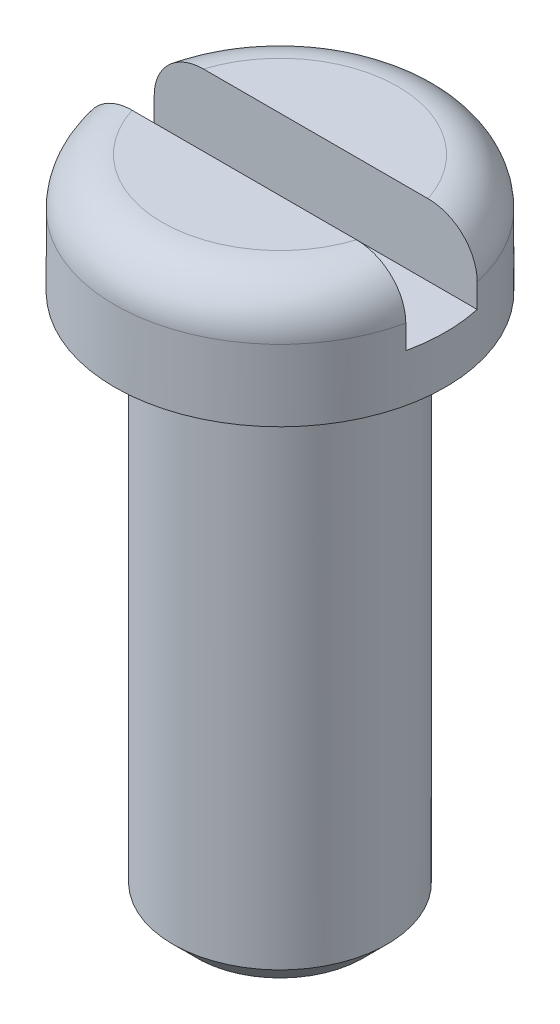
ISO-10303-21;
HEADER;
FILE_DESCRIPTION(('STEP AP214'),'2;1');
FILE_NAME('part.step','',(''),(''),'','','');
FILE_SCHEMA(('AUTOMOTIVE_DESIGN { 1 0 10303 214 1 1 1 1 }'));
ENDSEC;
DATA;
#1=APPLICATION_CONTEXT('core data for automotive mechanical design processes');
#2=APPLICATION_PROTOCOL_DEFINITION('international standard','automotive_design',2000,#1);
#3=PRODUCT_CONTEXT('',#1,'mechanical');
#4=PRODUCT('Part','Part','',(#3));
#5=PRODUCT_RELATED_PRODUCT_CATEGORY('part','',(#4));
#6=PRODUCT_DEFINITION_FORMATION('','',#4);
#7=PRODUCT_DEFINITION_CONTEXT('part definition',#1,'design');
#8=PRODUCT_DEFINITION('design','',#6,#7);
#9=PRODUCT_DEFINITION_SHAPE('','',#8);
#10=(LENGTH_UNIT() NAMED_UNIT(*) SI_UNIT(.MILLI.,.METRE.));
#11=(NAMED_UNIT(*) PLANE_ANGLE_UNIT() SI_UNIT($,.RADIAN.));
#12=(NAMED_UNIT(*) SI_UNIT($,.STERADIAN.) SOLID_ANGLE_UNIT());
#13=UNCERTAINTY_MEASURE_WITH_UNIT(LENGTH_MEASURE(1.E-05),#10,'distance_accuracy_value','');
#14=(GEOMETRIC_REPRESENTATION_CONTEXT(3) GLOBAL_UNCERTAINTY_ASSIGNED_CONTEXT((#13)) GLOBAL_UNIT_ASSIGNED_CONTEXT((#10,
#11,#12)) REPRESENTATION_CONTEXT('',''));
#15=CARTESIAN_POINT('',(0.,0.,0.));
#16=DIRECTION('',(0.,0.,1.));
#17=DIRECTION('',(1.,0.,0.));
#18=AXIS2_PLACEMENT_3D('',#15,#16,#17);
#19=CARTESIAN_POINT('',(0.,0.,0.));
#20=DIRECTION('',(0.,1.,0.));
#21=DIRECTION('',(0.,0.,1.));
#22=AXIS2_PLACEMENT_3D('',#19,#20,#21);
#23=PLANE('',#22);
#24=CARTESIAN_POINT('',(0.,0.,0.));
#25=DIRECTION('',(0.,1.,0.));
#26=DIRECTION('',(0.,0.,1.));
#27=AXIS2_PLACEMENT_3D('',#24,#25,#26);
#28=CIRCLE('',#27,1.39);
#29=CARTESIAN_POINT('',(0.,0.,1.39));
#30=VERTEX_POINT('',#29);
#31=EDGE_CURVE('E129',#30,#30,#28,.T.);
#32=ORIENTED_EDGE('',*,*,#31,.F.);
#33=EDGE_LOOP('',(#32));
#34=FACE_BOUND('',#33,.T.);
#35=CARTESIAN_POINT('',(0.,0.,0.));
#36=DIRECTION('',(0.,1.,0.));
#37=DIRECTION('',(0.,0.,1.));
#38=AXIS2_PLACEMENT_3D('',#35,#36,#37);
#39=CIRCLE('',#38,0.9);
#40=CARTESIAN_POINT('',(0.,0.,0.9));
#41=VERTEX_POINT('',#40);
#42=EDGE_CURVE('E205',#41,#41,#39,.F.);
#43=ORIENTED_EDGE('',*,*,#42,.F.);
#44=EDGE_LOOP('',(#43));
#45=FACE_BOUND('',#44,.T.);
#46=ADVANCED_FACE('F37',(#34,#45),#23,.F.);
#47=CARTESIAN_POINT('',(0.,1.,0.));
#48=DIRECTION('',(0.,1.,0.));
#49=DIRECTION('',(0.,0.,1.));
#50=AXIS2_PLACEMENT_3D('',#47,#48,#49);
#51=PLANE('',#50);
#52=DIRECTION('',(-1.,0.,0.));
#53=VECTOR('',#52,1.);
#54=CARTESIAN_POINT('',(0.,1.,-0.3));
#55=LINE('',#54,#53);
#56=CARTESIAN_POINT('',(0.943451111610983,1.,-0.3));
#57=VERTEX_POINT('',#56);
#58=CARTESIAN_POINT('',(-0.943451111610983,1.,-0.3));
#59=VERTEX_POINT('',#58);
#60=EDGE_CURVE('E117',#57,#59,#55,.T.);
#61=ORIENTED_EDGE('',*,*,#60,.F.);
#62=CARTESIAN_POINT('',(0.,1.,0.));
#63=DIRECTION('',(0.,1.,0.));
#64=DIRECTION('',(0.,0.,1.));
#65=AXIS2_PLACEMENT_3D('',#62,#63,#64);
#66=CIRCLE('',#65,0.99);
#67=EDGE_CURVE('E175',#57,#59,#66,.T.);
#68=ORIENTED_EDGE('',*,*,#67,.T.);
#69=EDGE_LOOP('',(#61,#68));
#70=FACE_BOUND('',#69,.T.);
#71=ADVANCED_FACE('F165',(#70),#51,.T.);
#72=CARTESIAN_POINT('',(0.,1.,0.));
#73=DIRECTION('',(0.,-1.,0.));
#74=DIRECTION('',(0.,0.,-1.));
#75=AXIS2_PLACEMENT_3D('',#72,#73,#74);
#76=CYLINDRICAL_SURFACE('',#75,1.39);
#77=DIRECTION('',(0.,-1.,0.));
#78=VECTOR('',#77,1.);
#79=CARTESIAN_POINT('',(1.35723984615837,1.,0.3));
#80=LINE('',#79,#78);
#81=CARTESIAN_POINT('',(1.35723984615837,0.4,0.3));
#82=VERTEX_POINT('',#81);
#83=CARTESIAN_POINT('',(1.35723984615837,0.6,0.3));
#84=VERTEX_POINT('',#83);
#85=EDGE_CURVE('E106',#82,#84,#80,.F.);
#86=ORIENTED_EDGE('',*,*,#85,.T.);
#87=CARTESIAN_POINT('',(0.,0.6,0.));
#88=DIRECTION('',(0.,1.,0.));
#89=DIRECTION('',(0.,0.,1.));
#90=AXIS2_PLACEMENT_3D('',#87,#88,#89);
#91=CIRCLE('',#90,1.39);
#92=CARTESIAN_POINT('',(-1.35723984615837,0.6,0.3));
#93=VERTEX_POINT('',#92);
#94=EDGE_CURVE('E101',#84,#93,#91,.F.);
#95=ORIENTED_EDGE('',*,*,#94,.T.);
#96=DIRECTION('',(0.,-1.,0.));
#97=VECTOR('',#96,1.);
#98=CARTESIAN_POINT('',(-1.35723984615837,1.,0.3));
#99=LINE('',#98,#97);
#100=CARTESIAN_POINT('',(-1.35723984615837,0.4,0.3));
#101=VERTEX_POINT('',#100);
#102=EDGE_CURVE('E92',#93,#101,#99,.T.);
#103=ORIENTED_EDGE('',*,*,#102,.T.);
#104=CARTESIAN_POINT('',(0.,0.4,0.));
#105=DIRECTION('',(0.,1.,0.));
#106=DIRECTION('',(0.,0.,1.));
#107=AXIS2_PLACEMENT_3D('',#104,#105,#106);
#108=CIRCLE('',#107,1.39);
#109=CARTESIAN_POINT('',(-1.35723984615837,0.4,-0.3));
#110=VERTEX_POINT('',#109);
#111=EDGE_CURVE('E98',#110,#101,#108,.T.);
#112=ORIENTED_EDGE('',*,*,#111,.F.);
#113=DIRECTION('',(0.,-1.,0.));
#114=VECTOR('',#113,1.);
#115=CARTESIAN_POINT('',(-1.35723984615837,1.,-0.3));
#116=LINE('',#115,#114);
#117=CARTESIAN_POINT('',(-1.35723984615837,0.6,-0.3));
#118=VERTEX_POINT('',#117);
#119=EDGE_CURVE('E105',#110,#118,#116,.F.);
#120=ORIENTED_EDGE('',*,*,#119,.T.);
#121=CARTESIAN_POINT('',(0.,0.6,0.));
#122=DIRECTION('',(0.,1.,0.));
#123=DIRECTION('',(0.,0.,1.));
#124=AXIS2_PLACEMENT_3D('',#121,#122,#123);
#125=CIRCLE('',#124,1.39);
#126=CARTESIAN_POINT('',(1.35723984615837,0.6,-0.3));
#127=VERTEX_POINT('',#126);
#128=EDGE_CURVE('E179',#118,#127,#125,.F.);
#129=ORIENTED_EDGE('',*,*,#128,.T.);
#130=DIRECTION('',(0.,-1.,0.));
#131=VECTOR('',#130,1.);
#132=CARTESIAN_POINT('',(1.35723984615837,1.,-0.3));
#133=LINE('',#132,#131);
#134=CARTESIAN_POINT('',(1.35723984615837,0.4,-0.3));
#135=VERTEX_POINT('',#134);
#136=EDGE_CURVE('E127',#127,#135,#133,.T.);
#137=ORIENTED_EDGE('',*,*,#136,.T.);
#138=EDGE_CURVE('E116',#82,#135,#108,.T.);
#139=ORIENTED_EDGE('',*,*,#138,.F.);
#140=EDGE_LOOP('',(#86,#95,#103,#112,#120,#129,#137,#139));
#141=FACE_BOUND('',#140,.T.);
#142=ORIENTED_EDGE('',*,*,#31,.T.);
#143=EDGE_LOOP('',(#142));
#144=FACE_BOUND('',#143,.T.);
#145=ADVANCED_FACE('F95',(#141,#144),#76,.T.);
#146=DIRECTION('',(1.,0.,0.));
#147=VECTOR('',#146,1.);
#148=CARTESIAN_POINT('',(0.,1.,0.3));
#149=LINE('',#148,#147);
#150=CARTESIAN_POINT('',(-0.943451111610983,1.,0.3));
#151=VERTEX_POINT('',#150);
#152=CARTESIAN_POINT('',(0.943451111610983,1.,0.3));
#153=VERTEX_POINT('',#152);
#154=EDGE_CURVE('E132',#151,#153,#149,.T.);
#155=ORIENTED_EDGE('',*,*,#154,.F.);
#156=CARTESIAN_POINT('',(0.,1.,0.));
#157=DIRECTION('',(0.,1.,0.));
#158=DIRECTION('',(0.,0.,1.));
#159=AXIS2_PLACEMENT_3D('',#156,#157,#158);
#160=CIRCLE('',#159,0.99);
#161=EDGE_CURVE('E135',#151,#153,#160,.T.);
#162=ORIENTED_EDGE('',*,*,#161,.T.);
#163=EDGE_LOOP('',(#155,#162));
#164=FACE_BOUND('',#163,.T.);
#165=ADVANCED_FACE('F160',(#164),#51,.T.);
#166=CARTESIAN_POINT('',(0.,0.4,0.));
#167=DIRECTION('',(0.,1.,0.));
#168=DIRECTION('',(0.,0.,1.));
#169=AXIS2_PLACEMENT_3D('',#166,#167,#168);
#170=PLANE('',#169);
#171=DIRECTION('',(1.,0.,0.));
#172=VECTOR('',#171,1.);
#173=CARTESIAN_POINT('',(-1.39,0.4,0.3));
#174=LINE('',#173,#172);
#175=EDGE_CURVE('E113',#101,#82,#174,.T.);
#176=ORIENTED_EDGE('',*,*,#175,.T.);
#177=ORIENTED_EDGE('',*,*,#138,.T.);
#178=DIRECTION('',(-1.,0.,0.));
#179=VECTOR('',#178,1.);
#180=CARTESIAN_POINT('',(-1.39,0.4,-0.3));
#181=LINE('',#180,#179);
#182=EDGE_CURVE('E115',#135,#110,#181,.T.);
#183=ORIENTED_EDGE('',*,*,#182,.T.);
#184=ORIENTED_EDGE('',*,*,#111,.T.);
#185=EDGE_LOOP('',(#176,#177,#183,#184));
#186=FACE_BOUND('',#185,.T.);
#187=ADVANCED_FACE('F111',(#186),#170,.T.);
#188=CARTESIAN_POINT('',(-1.39,0.4,-0.3));
#189=DIRECTION('',(0.,0.,-1.));
#190=DIRECTION('',(-1.,0.,0.));
#191=AXIS2_PLACEMENT_3D('',#188,#189,#190);
#192=PLANE('',#191);
#193=ORIENTED_EDGE('',*,*,#60,.T.);
#194=CARTESIAN_POINT('',(-0.943451111610983,1.,-0.3));
#195=CARTESIAN_POINT('',(-0.967443034095291,1.00002086758025,-0.3));
#196=CARTESIAN_POINT('',(-0.991445160268931,0.99804031931028,-0.3));
#197=CARTESIAN_POINT('',(-1.03881029079738,0.990131570342442,-0.3));
#198=CARTESIAN_POINT('',(-1.06217271126232,0.984199880601983,-0.3));
#199=CARTESIAN_POINT('',(-1.10758878019813,0.968432142765306,-0.3));
#200=CARTESIAN_POINT('',(-1.12964037159801,0.958590134996799,-0.3));
#201=CARTESIAN_POINT('',(-1.17168708956175,0.935233382963971,-0.3));
#202=CARTESIAN_POINT('',(-1.19168381459991,0.921721523736759,-0.3));
#203=CARTESIAN_POINT('',(-1.22839888358032,0.891850853469771,-0.3));
#204=CARTESIAN_POINT('',(-1.24519977899043,0.875593533409577,-0.3));
#205=CARTESIAN_POINT('',(-1.27573127158137,0.840402127444664,-0.3));
#206=CARTESIAN_POINT('',(-1.28946126624543,0.821467517437761,-0.3));
#207=CARTESIAN_POINT('',(-1.31301379073999,0.782107090188833,-0.3));
#208=CARTESIAN_POINT('',(-1.32294434279606,0.761745770976392,-0.3));
#209=CARTESIAN_POINT('',(-1.33916169103675,0.719630451089138,-0.3));
#210=CARTESIAN_POINT('',(-1.34545209832897,0.697877854472238,-0.3));
#211=CARTESIAN_POINT('',(-1.35228999883398,0.663285469875893,-0.3));
#212=CARTESIAN_POINT('',(-1.35414550808215,0.650690410532139,-0.3));
#213=CARTESIAN_POINT('',(-1.35661981509693,0.625398917162373,-0.3));
#214=CARTESIAN_POINT('',(-1.35724050443113,0.612702668148888,-0.3));
#215=CARTESIAN_POINT('',(-1.35723984615917,0.600000000000158,-0.3));
#216=B_SPLINE_CURVE_WITH_KNOTS('',3,(#194,#195,#196,#197,#198,#199,#200,#201,#202,#203,#204,
#205,#206,#207,#208,#209,#210,#211,#212,#213,#214,#215),.UNSPECIFIED.,.F.,.F.,(4,2,2,2,2,2,2,2,
2,2,4),(0.,0.071909611235487,0.14388280634809,0.215966118402708,0.287992925696334,
0.357782005010881,0.427584765091902,0.495221690213486,0.562791402409701,0.600930102126619,
0.639010333683361),.UNSPECIFIED.);
#217=EDGE_CURVE('E52',#59,#118,#216,.T.);
#218=ORIENTED_EDGE('',*,*,#217,.T.);
#219=ORIENTED_EDGE('',*,*,#119,.F.);
#220=ORIENTED_EDGE('',*,*,#182,.F.);
#221=ORIENTED_EDGE('',*,*,#136,.F.);
#222=CARTESIAN_POINT('',(1.35723984615837,0.6,-0.3));
#223=CARTESIAN_POINT('',(1.35726051032089,0.62208447712117,-0.3));
#224=CARTESIAN_POINT('',(1.3553680635093,0.644160990364712,-0.3));
#225=CARTESIAN_POINT('',(1.34791205141163,0.68765613262227,-0.3));
#226=CARTESIAN_POINT('',(1.34235336943311,0.7090755971429,-0.3));
#227=CARTESIAN_POINT('',(1.32771697728182,0.750683090045162,-0.3));
#228=CARTESIAN_POINT('',(1.31863817876208,0.770870735337514,-0.3));
#229=CARTESIAN_POINT('',(1.29724842947731,0.809450839432675,-0.3));
#230=CARTESIAN_POINT('',(1.28493755025878,0.827843337961138,-0.3));
#231=CARTESIAN_POINT('',(1.25734048367498,0.862485852901221,-0.3));
#232=CARTESIAN_POINT('',(1.24203089403327,0.878717211724598,-0.3));
#233=CARTESIAN_POINT('',(1.20895580325565,0.908447196303353,-0.3));
#234=CARTESIAN_POINT('',(1.19118997717922,0.921945459908752,-0.3));
#235=CARTESIAN_POINT('',(1.15329330717281,0.946158975285983,-0.3));
#236=CARTESIAN_POINT('',(1.13311847251967,0.956805268957307,-0.3));
#237=CARTESIAN_POINT('',(1.09130588799285,0.974681936777524,-0.3));
#238=CARTESIAN_POINT('',(1.06966801677414,0.98191202718645,-0.3));
#239=CARTESIAN_POINT('',(1.03056911083184,0.991588095928364,-0.3));
#240=CARTESIAN_POINT('',(1.01328041361348,0.994748959168989,-0.3));
#241=CARTESIAN_POINT('',(0.978478448853459,0.998955113680243,-0.3));
#242=CARTESIAN_POINT('',(0.960965639062977,1.0000041844556,-0.3));
#243=CARTESIAN_POINT('',(0.943451111610983,1.,-0.3));
#244=B_SPLINE_CURVE_WITH_KNOTS('',3,(#222,#223,#224,#225,#226,#227,#228,#229,#230,#231,#232,
#233,#234,#235,#236,#237,#238,#239,#240,#241,#242,#243),.UNSPECIFIED.,.F.,.F.,(4,2,2,2,2,2,2,2,
2,2,4),(0.,0.0661606430994985,0.13223333983269,0.198326481182877,0.264418159594812,
0.331047800024071,0.397686263473628,0.465814393712174,0.533948181481993,0.586549464019514,
0.639056521302321),.UNSPECIFIED.);
#245=EDGE_CURVE('E60',#127,#57,#244,.T.);
#246=ORIENTED_EDGE('',*,*,#245,.T.);
#247=EDGE_LOOP('',(#193,#218,#219,#220,#221,#246));
#248=FACE_BOUND('',#247,.T.);
#249=ADVANCED_FACE('F157',(#248),#192,.F.);
#250=CARTESIAN_POINT('',(-1.39,0.4,0.3));
#251=DIRECTION('',(0.,0.,1.));
#252=DIRECTION('',(1.,0.,0.));
#253=AXIS2_PLACEMENT_3D('',#250,#251,#252);
#254=PLANE('',#253);
#255=ORIENTED_EDGE('',*,*,#154,.T.);
#256=CARTESIAN_POINT('',(0.943451111610983,1.,0.3));
#257=CARTESIAN_POINT('',(0.967443034095291,1.00002086758025,0.3));
#258=CARTESIAN_POINT('',(0.991445160268931,0.99804031931028,0.3));
#259=CARTESIAN_POINT('',(1.03881029079738,0.990131570342442,0.3));
#260=CARTESIAN_POINT('',(1.06217271126232,0.984199880601983,0.3));
#261=CARTESIAN_POINT('',(1.10758878019813,0.968432142765306,0.3));
#262=CARTESIAN_POINT('',(1.12964037159801,0.958590134996799,0.3));
#263=CARTESIAN_POINT('',(1.17168708956175,0.935233382963971,0.3));
#264=CARTESIAN_POINT('',(1.19168381459991,0.921721523736759,0.3));
#265=CARTESIAN_POINT('',(1.22839888358032,0.891850853469771,0.3));
#266=CARTESIAN_POINT('',(1.24519977899043,0.875593533409577,0.3));
#267=CARTESIAN_POINT('',(1.27573127158137,0.840402127444664,0.3));
#268=CARTESIAN_POINT('',(1.28946126624543,0.821467517437761,0.3));
#269=CARTESIAN_POINT('',(1.31301379073999,0.782107090188833,0.3));
#270=CARTESIAN_POINT('',(1.32294434279606,0.761745770976392,0.3));
#271=CARTESIAN_POINT('',(1.33916169103675,0.719630451089138,0.3));
#272=CARTESIAN_POINT('',(1.34545209832897,0.697877854472238,0.3));
#273=CARTESIAN_POINT('',(1.35228999883398,0.663285469875893,0.3));
#274=CARTESIAN_POINT('',(1.35414550808215,0.650690410532139,0.3));
#275=CARTESIAN_POINT('',(1.35661981509693,0.625398917162373,0.3));
#276=CARTESIAN_POINT('',(1.35724050443113,0.612702668148888,0.3));
#277=CARTESIAN_POINT('',(1.35723984615917,0.600000000000158,0.3));
#278=B_SPLINE_CURVE_WITH_KNOTS('',3,(#256,#257,#258,#259,#260,#261,#262,#263,#264,#265,#266,
#267,#268,#269,#270,#271,#272,#273,#274,#275,#276,#277),.UNSPECIFIED.,.F.,.F.,(4,2,2,2,2,2,2,2,
2,2,4),(0.,0.071909611235487,0.14388280634809,0.215966118402708,0.287992925696334,
0.357782005010881,0.427584765091902,0.495221690213486,0.562791402409701,0.600930102126619,
0.639010333683361),.UNSPECIFIED.);
#279=EDGE_CURVE('E145',#153,#84,#278,.T.);
#280=ORIENTED_EDGE('',*,*,#279,.T.);
#281=ORIENTED_EDGE('',*,*,#85,.F.);
#282=ORIENTED_EDGE('',*,*,#175,.F.);
#283=ORIENTED_EDGE('',*,*,#102,.F.);
#284=CARTESIAN_POINT('',(-1.35723984615837,0.6,0.3));
#285=CARTESIAN_POINT('',(-1.35726051032089,0.62208447712117,0.3));
#286=CARTESIAN_POINT('',(-1.3553680635093,0.644160990364712,0.3));
#287=CARTESIAN_POINT('',(-1.34791205141163,0.68765613262227,0.3));
#288=CARTESIAN_POINT('',(-1.34235336943311,0.7090755971429,0.3));
#289=CARTESIAN_POINT('',(-1.32771697728182,0.750683090045162,0.3));
#290=CARTESIAN_POINT('',(-1.31863817876208,0.770870735337514,0.3));
#291=CARTESIAN_POINT('',(-1.29724842947731,0.809450839432675,0.3));
#292=CARTESIAN_POINT('',(-1.28493755025878,0.827843337961138,0.3));
#293=CARTESIAN_POINT('',(-1.25734048367498,0.862485852901221,0.3));
#294=CARTESIAN_POINT('',(-1.24203089403327,0.878717211724598,0.3));
#295=CARTESIAN_POINT('',(-1.20895580325565,0.908447196303353,0.3));
#296=CARTESIAN_POINT('',(-1.19118997717922,0.921945459908752,0.3));
#297=CARTESIAN_POINT('',(-1.15329330717281,0.946158975285983,0.3));
#298=CARTESIAN_POINT('',(-1.13311847251967,0.956805268957307,0.3));
#299=CARTESIAN_POINT('',(-1.09130588799285,0.974681936777524,0.3));
#300=CARTESIAN_POINT('',(-1.06966801677414,0.98191202718645,0.3));
#301=CARTESIAN_POINT('',(-1.03056911083184,0.991588095928364,0.3));
#302=CARTESIAN_POINT('',(-1.01328041361348,0.994748959168989,0.3));
#303=CARTESIAN_POINT('',(-0.978478448853459,0.998955113680243,0.3));
#304=CARTESIAN_POINT('',(-0.960965639062977,1.0000041844556,0.3));
#305=CARTESIAN_POINT('',(-0.943451111610983,1.,0.3));
#306=B_SPLINE_CURVE_WITH_KNOTS('',3,(#284,#285,#286,#287,#288,#289,#290,#291,#292,#293,#294,
#295,#296,#297,#298,#299,#300,#301,#302,#303,#304,#305),.UNSPECIFIED.,.F.,.F.,(4,2,2,2,2,2,2,2,
2,2,4),(0.,0.0661606430994985,0.13223333983269,0.198326481182877,0.264418159594812,
0.331047800024071,0.397686263473628,0.465814393712174,0.533948181481993,0.586549464019514,
0.639056521302321),.UNSPECIFIED.);
#307=EDGE_CURVE('E138',#93,#151,#306,.T.);
#308=ORIENTED_EDGE('',*,*,#307,.T.);
#309=EDGE_LOOP('',(#255,#280,#281,#282,#283,#308));
#310=FACE_BOUND('',#309,.T.);
#311=ADVANCED_FACE('F121',(#310),#254,.F.);
#312=CARTESIAN_POINT('',(0.,0.6,0.));
#313=DIRECTION('',(0.,1.,0.));
#314=DIRECTION('',(0.,0.,1.));
#315=AXIS2_PLACEMENT_3D('',#312,#313,#314);
#316=TOROIDAL_SURFACE('',#315,0.99,0.4);
#317=ORIENTED_EDGE('',*,*,#307,.F.);
#318=ORIENTED_EDGE('',*,*,#94,.F.);
#319=ORIENTED_EDGE('',*,*,#279,.F.);
#320=ORIENTED_EDGE('',*,*,#161,.F.);
#321=EDGE_LOOP('',(#317,#318,#319,#320));
#322=FACE_BOUND('',#321,.T.);
#323=ADVANCED_FACE('F150',(#322),#316,.T.);
#324=CARTESIAN_POINT('',(0.,0.6,0.));
#325=DIRECTION('',(0.,1.,0.));
#326=DIRECTION('',(0.,0.,1.));
#327=AXIS2_PLACEMENT_3D('',#324,#325,#326);
#328=TOROIDAL_SURFACE('',#327,0.99,0.4);
#329=ORIENTED_EDGE('',*,*,#245,.F.);
#330=ORIENTED_EDGE('',*,*,#128,.F.);
#331=ORIENTED_EDGE('',*,*,#217,.F.);
#332=ORIENTED_EDGE('',*,*,#67,.F.);
#333=EDGE_LOOP('',(#329,#330,#331,#332));
#334=FACE_BOUND('',#333,.T.);
#335=ADVANCED_FACE('F176',(#334),#328,.T.);
#336=CARTESIAN_POINT('',(0.,-4.5,0.));
#337=DIRECTION('',(0.,1.,0.));
#338=DIRECTION('',(0.,0.,1.));
#339=AXIS2_PLACEMENT_3D('',#336,#337,#338);
#340=CYLINDRICAL_SURFACE('',#339,0.9);
#341=CARTESIAN_POINT('',(0.,-4.3,0.));
#342=DIRECTION('',(0.,-1.,0.));
#343=DIRECTION('',(0.,0.,-1.));
#344=AXIS2_PLACEMENT_3D('',#341,#342,#343);
#345=CIRCLE('',#344,0.9);
#346=CARTESIAN_POINT('',(0.,-4.3,-0.9));
#347=VERTEX_POINT('',#346);
#348=EDGE_CURVE('E11',#347,#347,#345,.F.);
#349=ORIENTED_EDGE('',*,*,#348,.T.);
#350=EDGE_LOOP('',(#349));
#351=FACE_BOUND('',#350,.T.);
#352=ORIENTED_EDGE('',*,*,#42,.T.);
#353=EDGE_LOOP('',(#352));
#354=FACE_BOUND('',#353,.T.);
#355=ADVANCED_FACE('F191',(#351,#354),#340,.T.);
#356=CARTESIAN_POINT('',(0.,-4.5,0.));
#357=DIRECTION('',(0.,-1.,0.));
#358=DIRECTION('',(0.,0.,-1.));
#359=AXIS2_PLACEMENT_3D('',#356,#357,#358);
#360=PLANE('',#359);
#361=CARTESIAN_POINT('',(0.,-4.5,0.));
#362=DIRECTION('',(0.,-1.,0.));
#363=DIRECTION('',(0.,0.,-1.));
#364=AXIS2_PLACEMENT_3D('',#361,#362,#363);
#365=CIRCLE('',#364,0.699999999999998);
#366=CARTESIAN_POINT('',(0.,-4.5,-0.699999999999998));
#367=VERTEX_POINT('',#366);
#368=EDGE_CURVE('E45',#367,#367,#365,.T.);
#369=ORIENTED_EDGE('',*,*,#368,.T.);
#370=EDGE_LOOP('',(#369));
#371=FACE_BOUND('',#370,.T.);
#372=ADVANCED_FACE('F197',(#371),#360,.T.);
#373=CARTESIAN_POINT('',(0.,-4.5,0.));
#374=DIRECTION('',(0.,1.,0.));
#375=DIRECTION('',(0.,0.,1.));
#376=AXIS2_PLACEMENT_3D('',#373,#374,#375);
#377=CONICAL_SURFACE('',#376,0.699999999999998,0.785398163397447);
#378=ORIENTED_EDGE('',*,*,#348,.F.);
#379=EDGE_LOOP('',(#378));
#380=FACE_BOUND('',#379,.T.);
#381=ORIENTED_EDGE('',*,*,#368,.F.);
#382=EDGE_LOOP('',(#381));
#383=FACE_BOUND('',#382,.T.);
#384=ADVANCED_FACE('F39',(#380,#383),#377,.T.);
#385=CLOSED_SHELL('',(#46,#71,#145,#165,#187,#249,#311,#323,#335,#355,#372,#384));
#386=MANIFOLD_SOLID_BREP('B2',#385);
#387=ADVANCED_BREP_SHAPE_REPRESENTATION('',(#18,#386),#14);
#388=SHAPE_DEFINITION_REPRESENTATION(#9,#387);
ENDSEC;
END-ISO-10303-21;
